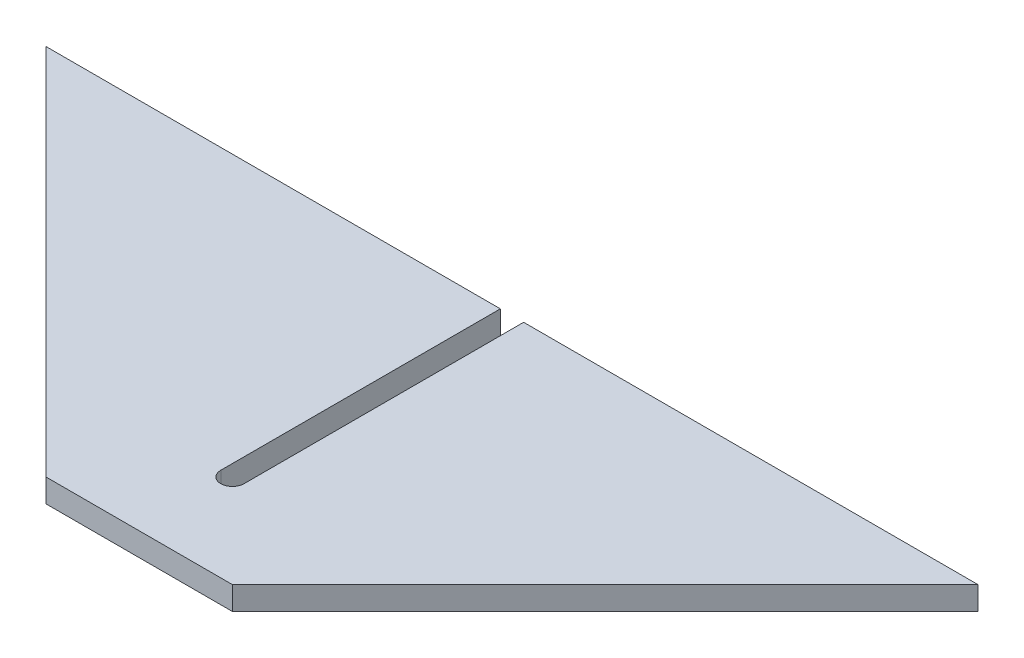
ISO-10303-21;
HEADER;
FILE_DESCRIPTION(('STEP AP214'),'2;1');
FILE_NAME('part.step','',(''),(''),'','','');
FILE_SCHEMA(('AUTOMOTIVE_DESIGN { 1 0 10303 214 1 1 1 1 }'));
ENDSEC;
DATA;
#1=APPLICATION_CONTEXT('core data for automotive mechanical design processes');
#2=APPLICATION_PROTOCOL_DEFINITION('international standard','automotive_design',2000,#1);
#3=PRODUCT_CONTEXT('',#1,'mechanical');
#4=PRODUCT('Part','Part','',(#3));
#5=PRODUCT_RELATED_PRODUCT_CATEGORY('part','',(#4));
#6=PRODUCT_DEFINITION_FORMATION('','',#4);
#7=PRODUCT_DEFINITION_CONTEXT('part definition',#1,'design');
#8=PRODUCT_DEFINITION('design','',#6,#7);
#9=PRODUCT_DEFINITION_SHAPE('','',#8);
#10=(LENGTH_UNIT() NAMED_UNIT(*) SI_UNIT(.MILLI.,.METRE.));
#11=(NAMED_UNIT(*) PLANE_ANGLE_UNIT() SI_UNIT($,.RADIAN.));
#12=(NAMED_UNIT(*) SI_UNIT($,.STERADIAN.) SOLID_ANGLE_UNIT());
#13=UNCERTAINTY_MEASURE_WITH_UNIT(LENGTH_MEASURE(1.E-05),#10,'distance_accuracy_value','');
#14=(GEOMETRIC_REPRESENTATION_CONTEXT(3) GLOBAL_UNCERTAINTY_ASSIGNED_CONTEXT((#13)) GLOBAL_UNIT_ASSIGNED_CONTEXT((#10,
#11,#12)) REPRESENTATION_CONTEXT('',''));
#15=CARTESIAN_POINT('',(0.,0.,0.));
#16=DIRECTION('',(0.,0.,1.));
#17=DIRECTION('',(1.,0.,0.));
#18=AXIS2_PLACEMENT_3D('',#15,#16,#17);
#19=CARTESIAN_POINT('',(0.,6.35,-50.8));
#20=DIRECTION('',(0.,0.,-1.));
#21=DIRECTION('',(-1.,0.,0.));
#22=AXIS2_PLACEMENT_3D('',#19,#20,#21);
#23=PLANE('',#22);
#24=DIRECTION('',(1.,0.,0.));
#25=VECTOR('',#24,1.);
#26=CARTESIAN_POINT('',(0.,0.,-50.8));
#27=LINE('',#26,#25);
#28=CARTESIAN_POINT('',(-127.,0.,-50.8));
#29=VERTEX_POINT('',#28);
#30=CARTESIAN_POINT('',(-3.17499999999999,0.,-50.8));
#31=VERTEX_POINT('',#30);
#32=EDGE_CURVE('E127',#29,#31,#27,.T.);
#33=ORIENTED_EDGE('',*,*,#32,.F.);
#34=DIRECTION('',(0.,-1.,0.));
#35=VECTOR('',#34,1.);
#36=CARTESIAN_POINT('',(-127.,6.35,-50.8));
#37=LINE('',#36,#35);
#38=CARTESIAN_POINT('',(-127.,6.35,-50.8));
#39=VERTEX_POINT('',#38);
#40=EDGE_CURVE('E11',#39,#29,#37,.T.);
#41=ORIENTED_EDGE('',*,*,#40,.F.);
#42=DIRECTION('',(1.,0.,0.));
#43=VECTOR('',#42,1.);
#44=CARTESIAN_POINT('',(0.,6.35,-50.8));
#45=LINE('',#44,#43);
#46=CARTESIAN_POINT('',(-3.17499999999999,6.35,-50.8));
#47=VERTEX_POINT('',#46);
#48=EDGE_CURVE('E146',#39,#47,#45,.T.);
#49=ORIENTED_EDGE('',*,*,#48,.T.);
#50=DIRECTION('',(0.,-1.,0.));
#51=VECTOR('',#50,1.);
#52=CARTESIAN_POINT('',(-3.17499999999999,6.35,-50.8));
#53=LINE('',#52,#51);
#54=EDGE_CURVE('E51',#47,#31,#53,.T.);
#55=ORIENTED_EDGE('',*,*,#54,.T.);
#56=EDGE_LOOP('',(#33,#41,#49,#55));
#57=FACE_BOUND('',#56,.T.);
#58=ADVANCED_FACE('F35',(#57),#23,.T.);
#59=CARTESIAN_POINT('',(-38.1,6.35,38.1));
#60=DIRECTION('',(-0.707106781186548,0.,0.707106781186548));
#61=DIRECTION('',(0.707106781186548,0.,0.707106781186548));
#62=AXIS2_PLACEMENT_3D('',#59,#60,#61);
#63=PLANE('',#62);
#64=DIRECTION('',(-0.707106781186548,0.,-0.707106781186548));
#65=VECTOR('',#64,1.);
#66=CARTESIAN_POINT('',(-38.1,0.,38.1));
#67=LINE('',#66,#65);
#68=CARTESIAN_POINT('',(-25.4,0.,50.8));
#69=VERTEX_POINT('',#68);
#70=EDGE_CURVE('E129',#69,#29,#67,.T.);
#71=ORIENTED_EDGE('',*,*,#70,.F.);
#72=DIRECTION('',(0.,-1.,0.));
#73=VECTOR('',#72,1.);
#74=CARTESIAN_POINT('',(-25.4,6.35,50.8));
#75=LINE('',#74,#73);
#76=CARTESIAN_POINT('',(-25.4,6.35,50.8));
#77=VERTEX_POINT('',#76);
#78=EDGE_CURVE('E43',#77,#69,#75,.T.);
#79=ORIENTED_EDGE('',*,*,#78,.F.);
#80=DIRECTION('',(-0.707106781186548,0.,-0.707106781186548));
#81=VECTOR('',#80,1.);
#82=CARTESIAN_POINT('',(-38.1,6.35,38.1));
#83=LINE('',#82,#81);
#84=EDGE_CURVE('E168',#77,#39,#83,.T.);
#85=ORIENTED_EDGE('',*,*,#84,.T.);
#86=ORIENTED_EDGE('',*,*,#40,.T.);
#87=EDGE_LOOP('',(#71,#79,#85,#86));
#88=FACE_BOUND('',#87,.T.);
#89=ADVANCED_FACE('F167',(#88),#63,.T.);
#90=CARTESIAN_POINT('',(0.,6.35,50.8));
#91=DIRECTION('',(0.,0.,-1.));
#92=DIRECTION('',(-1.,0.,0.));
#93=AXIS2_PLACEMENT_3D('',#90,#91,#92);
#94=PLANE('',#93);
#95=DIRECTION('',(1.,0.,0.));
#96=VECTOR('',#95,1.);
#97=CARTESIAN_POINT('',(0.,0.,50.8));
#98=LINE('',#97,#96);
#99=CARTESIAN_POINT('',(25.4,0.,50.8));
#100=VERTEX_POINT('',#99);
#101=EDGE_CURVE('E132',#69,#100,#98,.T.);
#102=ORIENTED_EDGE('',*,*,#101,.T.);
#103=DIRECTION('',(0.,-1.,0.));
#104=VECTOR('',#103,1.);
#105=CARTESIAN_POINT('',(25.4,6.35,50.8));
#106=LINE('',#105,#104);
#107=CARTESIAN_POINT('',(25.4,6.35,50.8));
#108=VERTEX_POINT('',#107);
#109=EDGE_CURVE('E152',#108,#100,#106,.T.);
#110=ORIENTED_EDGE('',*,*,#109,.F.);
#111=DIRECTION('',(1.,0.,0.));
#112=VECTOR('',#111,1.);
#113=CARTESIAN_POINT('',(0.,6.35,50.8));
#114=LINE('',#113,#112);
#115=EDGE_CURVE('E159',#77,#108,#114,.T.);
#116=ORIENTED_EDGE('',*,*,#115,.F.);
#117=ORIENTED_EDGE('',*,*,#78,.T.);
#118=EDGE_LOOP('',(#102,#110,#116,#117));
#119=FACE_BOUND('',#118,.T.);
#120=ADVANCED_FACE('F157',(#119),#94,.F.);
#121=CARTESIAN_POINT('',(38.1,6.35,38.1));
#122=DIRECTION('',(-0.707106781186548,0.,-0.707106781186547));
#123=DIRECTION('',(-0.707106781186547,0.,0.707106781186548));
#124=AXIS2_PLACEMENT_3D('',#121,#122,#123);
#125=PLANE('',#124);
#126=DIRECTION('',(0.707106781186547,0.,-0.707106781186548));
#127=VECTOR('',#126,1.);
#128=CARTESIAN_POINT('',(38.1,0.,38.1));
#129=LINE('',#128,#127);
#130=CARTESIAN_POINT('',(127.,0.,-50.8));
#131=VERTEX_POINT('',#130);
#132=EDGE_CURVE('E134',#100,#131,#129,.T.);
#133=ORIENTED_EDGE('',*,*,#132,.T.);
#134=DIRECTION('',(0.,-1.,0.));
#135=VECTOR('',#134,1.);
#136=CARTESIAN_POINT('',(127.,6.35,-50.8));
#137=LINE('',#136,#135);
#138=CARTESIAN_POINT('',(127.,6.35,-50.8));
#139=VERTEX_POINT('',#138);
#140=EDGE_CURVE('E150',#139,#131,#137,.T.);
#141=ORIENTED_EDGE('',*,*,#140,.F.);
#142=DIRECTION('',(0.707106781186547,0.,-0.707106781186548));
#143=VECTOR('',#142,1.);
#144=CARTESIAN_POINT('',(38.1,6.35,38.1));
#145=LINE('',#144,#143);
#146=EDGE_CURVE('E273',#108,#139,#145,.T.);
#147=ORIENTED_EDGE('',*,*,#146,.F.);
#148=ORIENTED_EDGE('',*,*,#109,.T.);
#149=EDGE_LOOP('',(#133,#141,#147,#148));
#150=FACE_BOUND('',#149,.T.);
#151=ADVANCED_FACE('F186',(#150),#125,.F.);
#152=CARTESIAN_POINT('',(0.,6.35,-50.8));
#153=DIRECTION('',(0.,0.,-1.));
#154=DIRECTION('',(-1.,0.,0.));
#155=AXIS2_PLACEMENT_3D('',#152,#153,#154);
#156=PLANE('',#155);
#157=DIRECTION('',(1.,0.,0.));
#158=VECTOR('',#157,1.);
#159=CARTESIAN_POINT('',(0.,0.,-50.8));
#160=LINE('',#159,#158);
#161=CARTESIAN_POINT('',(3.175,0.,-50.8));
#162=VERTEX_POINT('',#161);
#163=EDGE_CURVE('E137',#162,#131,#160,.T.);
#164=ORIENTED_EDGE('',*,*,#163,.F.);
#165=DIRECTION('',(0.,-1.,0.));
#166=VECTOR('',#165,1.);
#167=CARTESIAN_POINT('',(3.175,6.35,-50.8));
#168=LINE('',#167,#166);
#169=CARTESIAN_POINT('',(3.175,6.35,-50.8));
#170=VERTEX_POINT('',#169);
#171=EDGE_CURVE('E119',#170,#162,#168,.T.);
#172=ORIENTED_EDGE('',*,*,#171,.F.);
#173=DIRECTION('',(1.,0.,0.));
#174=VECTOR('',#173,1.);
#175=CARTESIAN_POINT('',(0.,6.35,-50.8));
#176=LINE('',#175,#174);
#177=EDGE_CURVE('E109',#170,#139,#176,.T.);
#178=ORIENTED_EDGE('',*,*,#177,.T.);
#179=ORIENTED_EDGE('',*,*,#140,.T.);
#180=EDGE_LOOP('',(#164,#172,#178,#179));
#181=FACE_BOUND('',#180,.T.);
#182=ADVANCED_FACE('F191',(#181),#156,.T.);
#183=CARTESIAN_POINT('',(3.17500000000001,6.35,0.));
#184=DIRECTION('',(1.,0.,0.));
#185=DIRECTION('',(0.,0.,-1.));
#186=AXIS2_PLACEMENT_3D('',#183,#184,#185);
#187=PLANE('',#186);
#188=DIRECTION('',(0.,0.,1.));
#189=VECTOR('',#188,1.);
#190=CARTESIAN_POINT('',(3.17500000000001,0.,0.));
#191=LINE('',#190,#189);
#192=CARTESIAN_POINT('',(3.17500000000001,0.,25.4));
#193=VERTEX_POINT('',#192);
#194=EDGE_CURVE('E116',#162,#193,#191,.T.);
#195=ORIENTED_EDGE('',*,*,#194,.T.);
#196=DIRECTION('',(0.,-1.,0.));
#197=VECTOR('',#196,1.);
#198=CARTESIAN_POINT('',(3.17500000000001,6.35,25.4));
#199=LINE('',#198,#197);
#200=CARTESIAN_POINT('',(3.17500000000001,6.35,25.4));
#201=VERTEX_POINT('',#200);
#202=EDGE_CURVE('E113',#201,#193,#199,.T.);
#203=ORIENTED_EDGE('',*,*,#202,.F.);
#204=DIRECTION('',(0.,0.,1.));
#205=VECTOR('',#204,1.);
#206=CARTESIAN_POINT('',(3.17500000000001,6.35,0.));
#207=LINE('',#206,#205);
#208=EDGE_CURVE('E102',#170,#201,#207,.T.);
#209=ORIENTED_EDGE('',*,*,#208,.F.);
#210=ORIENTED_EDGE('',*,*,#171,.T.);
#211=EDGE_LOOP('',(#195,#203,#209,#210));
#212=FACE_BOUND('',#211,.T.);
#213=ADVANCED_FACE('F114',(#212),#187,.F.);
#214=CARTESIAN_POINT('',(0.,6.35,25.4));
#215=DIRECTION('',(0.,-1.,0.));
#216=DIRECTION('',(0.,0.,-1.));
#217=AXIS2_PLACEMENT_3D('',#214,#215,#216);
#218=CYLINDRICAL_SURFACE('',#217,3.175);
#219=CARTESIAN_POINT('',(0.,0.,25.4));
#220=DIRECTION('',(0.,1.,0.));
#221=DIRECTION('',(0.,0.,1.));
#222=AXIS2_PLACEMENT_3D('',#219,#220,#221);
#223=CIRCLE('',#222,3.175);
#224=CARTESIAN_POINT('',(-3.17499999999999,0.,25.4));
#225=VERTEX_POINT('',#224);
#226=EDGE_CURVE('E141',#225,#193,#223,.T.);
#227=ORIENTED_EDGE('',*,*,#226,.F.);
#228=DIRECTION('',(0.,-1.,0.));
#229=VECTOR('',#228,1.);
#230=CARTESIAN_POINT('',(-3.17499999999999,6.35,25.4));
#231=LINE('',#230,#229);
#232=CARTESIAN_POINT('',(-3.17499999999999,6.35,25.4));
#233=VERTEX_POINT('',#232);
#234=EDGE_CURVE('E76',#233,#225,#231,.T.);
#235=ORIENTED_EDGE('',*,*,#234,.F.);
#236=CARTESIAN_POINT('',(0.,6.35,25.4));
#237=DIRECTION('',(0.,1.,0.));
#238=DIRECTION('',(0.,0.,1.));
#239=AXIS2_PLACEMENT_3D('',#236,#237,#238);
#240=CIRCLE('',#239,3.175);
#241=EDGE_CURVE('E107',#233,#201,#240,.T.);
#242=ORIENTED_EDGE('',*,*,#241,.T.);
#243=ORIENTED_EDGE('',*,*,#202,.T.);
#244=EDGE_LOOP('',(#227,#235,#242,#243));
#245=FACE_BOUND('',#244,.T.);
#246=ADVANCED_FACE('F121',(#245),#218,.F.);
#247=CARTESIAN_POINT('',(-3.17499999999999,6.35,0.));
#248=DIRECTION('',(1.,0.,0.));
#249=DIRECTION('',(0.,0.,-1.));
#250=AXIS2_PLACEMENT_3D('',#247,#248,#249);
#251=PLANE('',#250);
#252=DIRECTION('',(0.,0.,1.));
#253=VECTOR('',#252,1.);
#254=CARTESIAN_POINT('',(-3.17499999999999,0.,0.));
#255=LINE('',#254,#253);
#256=EDGE_CURVE('E143',#31,#225,#255,.T.);
#257=ORIENTED_EDGE('',*,*,#256,.F.);
#258=ORIENTED_EDGE('',*,*,#54,.F.);
#259=DIRECTION('',(0.,0.,1.));
#260=VECTOR('',#259,1.);
#261=CARTESIAN_POINT('',(-3.17499999999999,6.35,0.));
#262=LINE('',#261,#260);
#263=EDGE_CURVE('E122',#47,#233,#262,.T.);
#264=ORIENTED_EDGE('',*,*,#263,.T.);
#265=ORIENTED_EDGE('',*,*,#234,.T.);
#266=EDGE_LOOP('',(#257,#258,#264,#265));
#267=FACE_BOUND('',#266,.T.);
#268=ADVANCED_FACE('F169',(#267),#251,.T.);
#269=CARTESIAN_POINT('',(0.,6.35,0.));
#270=DIRECTION('',(0.,1.,0.));
#271=DIRECTION('',(0.,0.,1.));
#272=AXIS2_PLACEMENT_3D('',#269,#270,#271);
#273=PLANE('',#272);
#274=ORIENTED_EDGE('',*,*,#48,.F.);
#275=ORIENTED_EDGE('',*,*,#84,.F.);
#276=ORIENTED_EDGE('',*,*,#115,.T.);
#277=ORIENTED_EDGE('',*,*,#146,.T.);
#278=ORIENTED_EDGE('',*,*,#177,.F.);
#279=ORIENTED_EDGE('',*,*,#208,.T.);
#280=ORIENTED_EDGE('',*,*,#241,.F.);
#281=ORIENTED_EDGE('',*,*,#263,.F.);
#282=EDGE_LOOP('',(#274,#275,#276,#277,#278,#279,#280,#281));
#283=FACE_BOUND('',#282,.T.);
#284=ADVANCED_FACE('F104',(#283),#273,.T.);
#285=CARTESIAN_POINT('',(0.,0.,0.));
#286=DIRECTION('',(0.,1.,0.));
#287=DIRECTION('',(0.,0.,1.));
#288=AXIS2_PLACEMENT_3D('',#285,#286,#287);
#289=PLANE('',#288);
#290=ORIENTED_EDGE('',*,*,#32,.T.);
#291=ORIENTED_EDGE('',*,*,#256,.T.);
#292=ORIENTED_EDGE('',*,*,#226,.T.);
#293=ORIENTED_EDGE('',*,*,#194,.F.);
#294=ORIENTED_EDGE('',*,*,#163,.T.);
#295=ORIENTED_EDGE('',*,*,#132,.F.);
#296=ORIENTED_EDGE('',*,*,#101,.F.);
#297=ORIENTED_EDGE('',*,*,#70,.T.);
#298=EDGE_LOOP('',(#290,#291,#292,#293,#294,#295,#296,#297));
#299=FACE_BOUND('',#298,.T.);
#300=ADVANCED_FACE('F166',(#299),#289,.F.);
#301=CLOSED_SHELL('',(#58,#89,#120,#151,#182,#213,#246,#268,#284,#300));
#302=MANIFOLD_SOLID_BREP('B2',#301);
#303=ADVANCED_BREP_SHAPE_REPRESENTATION('',(#18,#302),#14);
#304=SHAPE_DEFINITION_REPRESENTATION(#9,#303);
ENDSEC;
END-ISO-10303-21;
